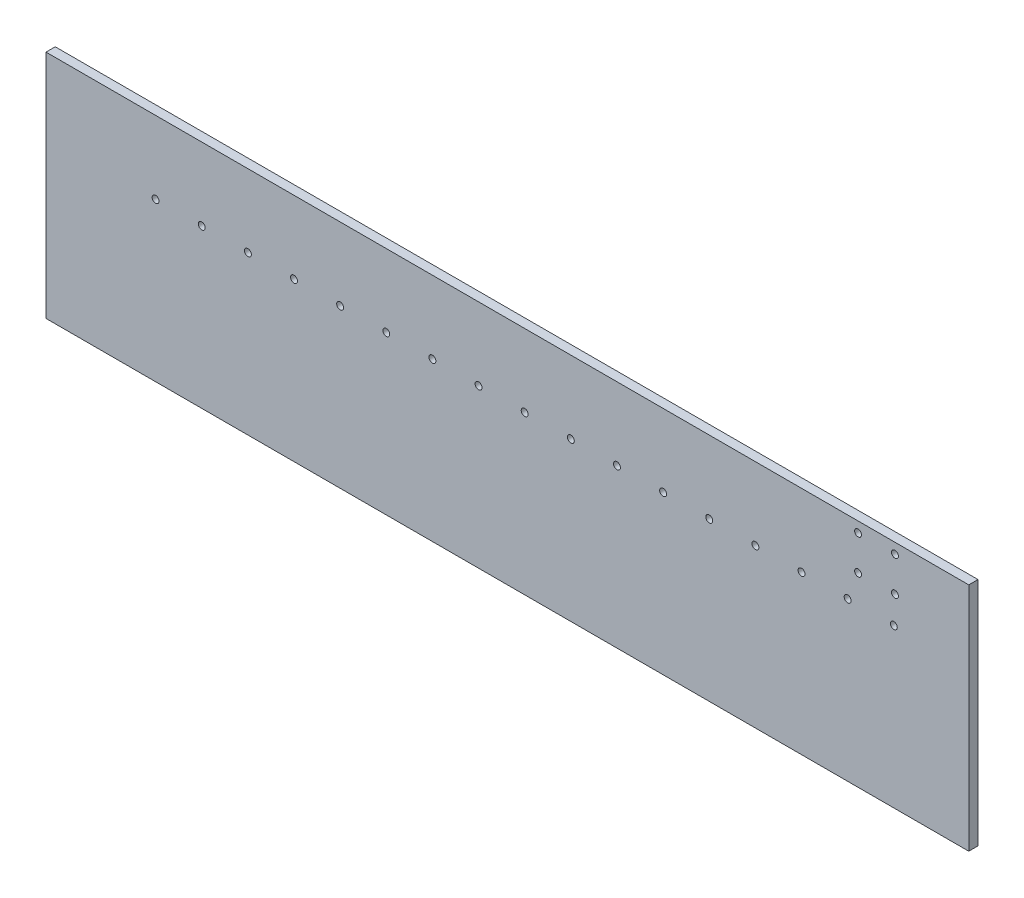
ISO-10303-21;
HEADER;
FILE_DESCRIPTION(('STEP AP214'),'2;1');
FILE_NAME('part.step','',(''),(''),'','','');
FILE_SCHEMA(('AUTOMOTIVE_DESIGN { 1 0 10303 214 1 1 1 1 }'));
ENDSEC;
DATA;
#1=APPLICATION_CONTEXT('core data for automotive mechanical design processes');
#2=APPLICATION_PROTOCOL_DEFINITION('international standard','automotive_design',2000,#1);
#3=PRODUCT_CONTEXT('',#1,'mechanical');
#4=PRODUCT('Part','Part','',(#3));
#5=PRODUCT_RELATED_PRODUCT_CATEGORY('part','',(#4));
#6=PRODUCT_DEFINITION_FORMATION('','',#4);
#7=PRODUCT_DEFINITION_CONTEXT('part definition',#1,'design');
#8=PRODUCT_DEFINITION('design','',#6,#7);
#9=PRODUCT_DEFINITION_SHAPE('','',#8);
#10=(LENGTH_UNIT() NAMED_UNIT(*) SI_UNIT(.MILLI.,.METRE.));
#11=(NAMED_UNIT(*) PLANE_ANGLE_UNIT() SI_UNIT($,.RADIAN.));
#12=(NAMED_UNIT(*) SI_UNIT($,.STERADIAN.) SOLID_ANGLE_UNIT());
#13=UNCERTAINTY_MEASURE_WITH_UNIT(LENGTH_MEASURE(1.E-05),#10,'distance_accuracy_value','');
#14=(GEOMETRIC_REPRESENTATION_CONTEXT(3) GLOBAL_UNCERTAINTY_ASSIGNED_CONTEXT((#13)) GLOBAL_UNIT_ASSIGNED_CONTEXT((#10,
#11,#12)) REPRESENTATION_CONTEXT('',''));
#15=CARTESIAN_POINT('',(0.,0.,0.));
#16=DIRECTION('',(0.,0.,1.));
#17=DIRECTION('',(1.,0.,0.));
#18=AXIS2_PLACEMENT_3D('',#15,#16,#17);
#19=CARTESIAN_POINT('',(47.5000000000003,68.5000000000001,4.));
#20=DIRECTION('',(0.,0.,-1.));
#21=DIRECTION('',(-1.,0.,0.));
#22=AXIS2_PLACEMENT_3D('',#19,#20,#21);
#23=CYLINDRICAL_SURFACE('',#22,1.50000000000002);
#24=CARTESIAN_POINT('',(47.5000000000003,68.5000000000001,4.));
#25=DIRECTION('',(0.,0.,-1.));
#26=DIRECTION('',(-1.,0.,0.));
#27=AXIS2_PLACEMENT_3D('',#24,#25,#26);
#28=CIRCLE('',#27,1.50000000000002);
#29=CARTESIAN_POINT('',(46.0000000000002,68.5000000000001,4.));
#30=VERTEX_POINT('',#29);
#31=EDGE_CURVE('E43',#30,#30,#28,.T.);
#32=ORIENTED_EDGE('',*,*,#31,.F.);
#33=EDGE_LOOP('',(#32));
#34=FACE_BOUND('',#33,.T.);
#35=CARTESIAN_POINT('',(47.5000000000003,68.5000000000001,0.));
#36=DIRECTION('',(0.,0.,-1.));
#37=DIRECTION('',(-1.,0.,0.));
#38=AXIS2_PLACEMENT_3D('',#35,#36,#37);
#39=CIRCLE('',#38,1.50000000000002);
#40=CARTESIAN_POINT('',(46.0000000000002,68.5000000000001,0.));
#41=VERTEX_POINT('',#40);
#42=EDGE_CURVE('E11',#41,#41,#39,.T.);
#43=ORIENTED_EDGE('',*,*,#42,.T.);
#44=EDGE_LOOP('',(#43));
#45=FACE_BOUND('',#44,.T.);
#46=ADVANCED_FACE('F35',(#34,#45),#23,.F.);
#47=CARTESIAN_POINT('',(67.5000000000003,68.5000000000001,4.));
#48=DIRECTION('',(0.,0.,-1.));
#49=DIRECTION('',(-1.,0.,0.));
#50=AXIS2_PLACEMENT_3D('',#47,#48,#49);
#51=CYLINDRICAL_SURFACE('',#50,1.50000000000002);
#52=CARTESIAN_POINT('',(67.5000000000003,68.5000000000001,4.));
#53=DIRECTION('',(0.,0.,-1.));
#54=DIRECTION('',(-1.,0.,0.));
#55=AXIS2_PLACEMENT_3D('',#52,#53,#54);
#56=CIRCLE('',#55,1.50000000000002);
#57=CARTESIAN_POINT('',(66.0000000000003,68.5000000000001,4.));
#58=VERTEX_POINT('',#57);
#59=EDGE_CURVE('E191',#58,#58,#56,.T.);
#60=ORIENTED_EDGE('',*,*,#59,.F.);
#61=EDGE_LOOP('',(#60));
#62=FACE_BOUND('',#61,.T.);
#63=CARTESIAN_POINT('',(67.5000000000003,68.5000000000001,0.));
#64=DIRECTION('',(0.,0.,-1.));
#65=DIRECTION('',(-1.,0.,0.));
#66=AXIS2_PLACEMENT_3D('',#63,#64,#65);
#67=CIRCLE('',#66,1.50000000000002);
#68=CARTESIAN_POINT('',(66.0000000000003,68.5000000000001,0.));
#69=VERTEX_POINT('',#68);
#70=EDGE_CURVE('E194',#69,#69,#67,.T.);
#71=ORIENTED_EDGE('',*,*,#70,.T.);
#72=EDGE_LOOP('',(#71));
#73=FACE_BOUND('',#72,.T.);
#74=ADVANCED_FACE('F202',(#62,#73),#51,.F.);
#75=CARTESIAN_POINT('',(87.5000000000002,68.5000000000001,4.));
#76=DIRECTION('',(0.,0.,-1.));
#77=DIRECTION('',(-1.,0.,0.));
#78=AXIS2_PLACEMENT_3D('',#75,#76,#77);
#79=CYLINDRICAL_SURFACE('',#78,1.50000000000002);
#80=CARTESIAN_POINT('',(87.5000000000002,68.5000000000001,4.));
#81=DIRECTION('',(0.,0.,-1.));
#82=DIRECTION('',(-1.,0.,0.));
#83=AXIS2_PLACEMENT_3D('',#80,#81,#82);
#84=CIRCLE('',#83,1.50000000000002);
#85=CARTESIAN_POINT('',(86.0000000000002,68.5000000000001,4.));
#86=VERTEX_POINT('',#85);
#87=EDGE_CURVE('E185',#86,#86,#84,.T.);
#88=ORIENTED_EDGE('',*,*,#87,.F.);
#89=EDGE_LOOP('',(#88));
#90=FACE_BOUND('',#89,.T.);
#91=CARTESIAN_POINT('',(87.5000000000002,68.5000000000001,0.));
#92=DIRECTION('',(0.,0.,-1.));
#93=DIRECTION('',(-1.,0.,0.));
#94=AXIS2_PLACEMENT_3D('',#91,#92,#93);
#95=CIRCLE('',#94,1.50000000000002);
#96=CARTESIAN_POINT('',(86.0000000000002,68.5000000000001,0.));
#97=VERTEX_POINT('',#96);
#98=EDGE_CURVE('E188',#97,#97,#95,.T.);
#99=ORIENTED_EDGE('',*,*,#98,.T.);
#100=EDGE_LOOP('',(#99));
#101=FACE_BOUND('',#100,.T.);
#102=ADVANCED_FACE('F280',(#90,#101),#79,.F.);
#103=CARTESIAN_POINT('',(107.5,68.5000000000001,4.));
#104=DIRECTION('',(0.,0.,-1.));
#105=DIRECTION('',(-1.,0.,0.));
#106=AXIS2_PLACEMENT_3D('',#103,#104,#105);
#107=CYLINDRICAL_SURFACE('',#106,1.50000000000002);
#108=CARTESIAN_POINT('',(107.5,68.5000000000001,4.));
#109=DIRECTION('',(0.,0.,-1.));
#110=DIRECTION('',(-1.,0.,0.));
#111=AXIS2_PLACEMENT_3D('',#108,#109,#110);
#112=CIRCLE('',#111,1.50000000000002);
#113=CARTESIAN_POINT('',(106.,68.5000000000001,4.));
#114=VERTEX_POINT('',#113);
#115=EDGE_CURVE('E179',#114,#114,#112,.T.);
#116=ORIENTED_EDGE('',*,*,#115,.F.);
#117=EDGE_LOOP('',(#116));
#118=FACE_BOUND('',#117,.T.);
#119=CARTESIAN_POINT('',(107.5,68.5000000000001,0.));
#120=DIRECTION('',(0.,0.,-1.));
#121=DIRECTION('',(-1.,0.,0.));
#122=AXIS2_PLACEMENT_3D('',#119,#120,#121);
#123=CIRCLE('',#122,1.50000000000002);
#124=CARTESIAN_POINT('',(106.,68.5000000000001,0.));
#125=VERTEX_POINT('',#124);
#126=EDGE_CURVE('E182',#125,#125,#123,.T.);
#127=ORIENTED_EDGE('',*,*,#126,.T.);
#128=EDGE_LOOP('',(#127));
#129=FACE_BOUND('',#128,.T.);
#130=ADVANCED_FACE('F276',(#118,#129),#107,.F.);
#131=CARTESIAN_POINT('',(127.5,68.5000000000001,4.));
#132=DIRECTION('',(0.,0.,-1.));
#133=DIRECTION('',(-1.,0.,0.));
#134=AXIS2_PLACEMENT_3D('',#131,#132,#133);
#135=CYLINDRICAL_SURFACE('',#134,1.50000000000002);
#136=CARTESIAN_POINT('',(127.5,68.5000000000001,4.));
#137=DIRECTION('',(0.,0.,-1.));
#138=DIRECTION('',(-1.,0.,0.));
#139=AXIS2_PLACEMENT_3D('',#136,#137,#138);
#140=CIRCLE('',#139,1.50000000000002);
#141=CARTESIAN_POINT('',(126.,68.5000000000001,4.));
#142=VERTEX_POINT('',#141);
#143=EDGE_CURVE('E173',#142,#142,#140,.T.);
#144=ORIENTED_EDGE('',*,*,#143,.F.);
#145=EDGE_LOOP('',(#144));
#146=FACE_BOUND('',#145,.T.);
#147=CARTESIAN_POINT('',(127.5,68.5000000000001,0.));
#148=DIRECTION('',(0.,0.,-1.));
#149=DIRECTION('',(-1.,0.,0.));
#150=AXIS2_PLACEMENT_3D('',#147,#148,#149);
#151=CIRCLE('',#150,1.50000000000002);
#152=CARTESIAN_POINT('',(126.,68.5000000000001,0.));
#153=VERTEX_POINT('',#152);
#154=EDGE_CURVE('E176',#153,#153,#151,.T.);
#155=ORIENTED_EDGE('',*,*,#154,.T.);
#156=EDGE_LOOP('',(#155));
#157=FACE_BOUND('',#156,.T.);
#158=ADVANCED_FACE('F272',(#146,#157),#135,.F.);
#159=CARTESIAN_POINT('',(147.5,68.5000000000001,4.));
#160=DIRECTION('',(0.,0.,-1.));
#161=DIRECTION('',(-1.,0.,0.));
#162=AXIS2_PLACEMENT_3D('',#159,#160,#161);
#163=CYLINDRICAL_SURFACE('',#162,1.50000000000002);
#164=CARTESIAN_POINT('',(147.5,68.5000000000001,4.));
#165=DIRECTION('',(0.,0.,-1.));
#166=DIRECTION('',(-1.,0.,0.));
#167=AXIS2_PLACEMENT_3D('',#164,#165,#166);
#168=CIRCLE('',#167,1.50000000000002);
#169=CARTESIAN_POINT('',(146.,68.5000000000001,4.));
#170=VERTEX_POINT('',#169);
#171=EDGE_CURVE('E167',#170,#170,#168,.T.);
#172=ORIENTED_EDGE('',*,*,#171,.F.);
#173=EDGE_LOOP('',(#172));
#174=FACE_BOUND('',#173,.T.);
#175=CARTESIAN_POINT('',(147.5,68.5000000000001,0.));
#176=DIRECTION('',(0.,0.,-1.));
#177=DIRECTION('',(-1.,0.,0.));
#178=AXIS2_PLACEMENT_3D('',#175,#176,#177);
#179=CIRCLE('',#178,1.50000000000002);
#180=CARTESIAN_POINT('',(146.,68.5000000000001,0.));
#181=VERTEX_POINT('',#180);
#182=EDGE_CURVE('E170',#181,#181,#179,.T.);
#183=ORIENTED_EDGE('',*,*,#182,.T.);
#184=EDGE_LOOP('',(#183));
#185=FACE_BOUND('',#184,.T.);
#186=ADVANCED_FACE('F268',(#174,#185),#163,.F.);
#187=CARTESIAN_POINT('',(167.5,68.5000000000001,4.));
#188=DIRECTION('',(0.,0.,-1.));
#189=DIRECTION('',(-1.,0.,0.));
#190=AXIS2_PLACEMENT_3D('',#187,#188,#189);
#191=CYLINDRICAL_SURFACE('',#190,1.50000000000002);
#192=CARTESIAN_POINT('',(167.5,68.5000000000001,4.));
#193=DIRECTION('',(0.,0.,-1.));
#194=DIRECTION('',(-1.,0.,0.));
#195=AXIS2_PLACEMENT_3D('',#192,#193,#194);
#196=CIRCLE('',#195,1.50000000000002);
#197=CARTESIAN_POINT('',(166.,68.5000000000001,4.));
#198=VERTEX_POINT('',#197);
#199=EDGE_CURVE('E161',#198,#198,#196,.T.);
#200=ORIENTED_EDGE('',*,*,#199,.F.);
#201=EDGE_LOOP('',(#200));
#202=FACE_BOUND('',#201,.T.);
#203=CARTESIAN_POINT('',(167.5,68.5000000000001,0.));
#204=DIRECTION('',(0.,0.,-1.));
#205=DIRECTION('',(-1.,0.,0.));
#206=AXIS2_PLACEMENT_3D('',#203,#204,#205);
#207=CIRCLE('',#206,1.50000000000002);
#208=CARTESIAN_POINT('',(166.,68.5000000000001,0.));
#209=VERTEX_POINT('',#208);
#210=EDGE_CURVE('E164',#209,#209,#207,.T.);
#211=ORIENTED_EDGE('',*,*,#210,.T.);
#212=EDGE_LOOP('',(#211));
#213=FACE_BOUND('',#212,.T.);
#214=ADVANCED_FACE('F264',(#202,#213),#191,.F.);
#215=CARTESIAN_POINT('',(187.5,68.5000000000001,4.));
#216=DIRECTION('',(0.,0.,-1.));
#217=DIRECTION('',(-1.,0.,0.));
#218=AXIS2_PLACEMENT_3D('',#215,#216,#217);
#219=CYLINDRICAL_SURFACE('',#218,1.50000000000002);
#220=CARTESIAN_POINT('',(187.5,68.5000000000001,4.));
#221=DIRECTION('',(0.,0.,-1.));
#222=DIRECTION('',(-1.,0.,0.));
#223=AXIS2_PLACEMENT_3D('',#220,#221,#222);
#224=CIRCLE('',#223,1.50000000000002);
#225=CARTESIAN_POINT('',(186.,68.5000000000001,4.));
#226=VERTEX_POINT('',#225);
#227=EDGE_CURVE('E155',#226,#226,#224,.T.);
#228=ORIENTED_EDGE('',*,*,#227,.F.);
#229=EDGE_LOOP('',(#228));
#230=FACE_BOUND('',#229,.T.);
#231=CARTESIAN_POINT('',(187.5,68.5000000000001,0.));
#232=DIRECTION('',(0.,0.,-1.));
#233=DIRECTION('',(-1.,0.,0.));
#234=AXIS2_PLACEMENT_3D('',#231,#232,#233);
#235=CIRCLE('',#234,1.50000000000002);
#236=CARTESIAN_POINT('',(186.,68.5000000000001,0.));
#237=VERTEX_POINT('',#236);
#238=EDGE_CURVE('E158',#237,#237,#235,.T.);
#239=ORIENTED_EDGE('',*,*,#238,.T.);
#240=EDGE_LOOP('',(#239));
#241=FACE_BOUND('',#240,.T.);
#242=ADVANCED_FACE('F260',(#230,#241),#219,.F.);
#243=CARTESIAN_POINT('',(207.5,68.5000000000001,4.));
#244=DIRECTION('',(0.,0.,-1.));
#245=DIRECTION('',(-1.,0.,0.));
#246=AXIS2_PLACEMENT_3D('',#243,#244,#245);
#247=CYLINDRICAL_SURFACE('',#246,1.50000000000002);
#248=CARTESIAN_POINT('',(207.5,68.5000000000001,4.));
#249=DIRECTION('',(0.,0.,-1.));
#250=DIRECTION('',(-1.,0.,0.));
#251=AXIS2_PLACEMENT_3D('',#248,#249,#250);
#252=CIRCLE('',#251,1.50000000000002);
#253=CARTESIAN_POINT('',(206.,68.5000000000001,4.));
#254=VERTEX_POINT('',#253);
#255=EDGE_CURVE('E149',#254,#254,#252,.T.);
#256=ORIENTED_EDGE('',*,*,#255,.F.);
#257=EDGE_LOOP('',(#256));
#258=FACE_BOUND('',#257,.T.);
#259=CARTESIAN_POINT('',(207.5,68.5000000000001,0.));
#260=DIRECTION('',(0.,0.,-1.));
#261=DIRECTION('',(-1.,0.,0.));
#262=AXIS2_PLACEMENT_3D('',#259,#260,#261);
#263=CIRCLE('',#262,1.50000000000002);
#264=CARTESIAN_POINT('',(206.,68.5000000000001,0.));
#265=VERTEX_POINT('',#264);
#266=EDGE_CURVE('E152',#265,#265,#263,.T.);
#267=ORIENTED_EDGE('',*,*,#266,.T.);
#268=EDGE_LOOP('',(#267));
#269=FACE_BOUND('',#268,.T.);
#270=ADVANCED_FACE('F256',(#258,#269),#247,.F.);
#271=CARTESIAN_POINT('',(227.5,68.5000000000001,4.));
#272=DIRECTION('',(0.,0.,-1.));
#273=DIRECTION('',(-1.,0.,0.));
#274=AXIS2_PLACEMENT_3D('',#271,#272,#273);
#275=CYLINDRICAL_SURFACE('',#274,1.50000000000002);
#276=CARTESIAN_POINT('',(227.5,68.5000000000001,4.));
#277=DIRECTION('',(0.,0.,-1.));
#278=DIRECTION('',(-1.,0.,0.));
#279=AXIS2_PLACEMENT_3D('',#276,#277,#278);
#280=CIRCLE('',#279,1.50000000000002);
#281=CARTESIAN_POINT('',(226.,68.5000000000001,4.));
#282=VERTEX_POINT('',#281);
#283=EDGE_CURVE('E143',#282,#282,#280,.T.);
#284=ORIENTED_EDGE('',*,*,#283,.F.);
#285=EDGE_LOOP('',(#284));
#286=FACE_BOUND('',#285,.T.);
#287=CARTESIAN_POINT('',(227.5,68.5000000000001,0.));
#288=DIRECTION('',(0.,0.,-1.));
#289=DIRECTION('',(-1.,0.,0.));
#290=AXIS2_PLACEMENT_3D('',#287,#288,#289);
#291=CIRCLE('',#290,1.50000000000002);
#292=CARTESIAN_POINT('',(226.,68.5000000000001,0.));
#293=VERTEX_POINT('',#292);
#294=EDGE_CURVE('E146',#293,#293,#291,.T.);
#295=ORIENTED_EDGE('',*,*,#294,.T.);
#296=EDGE_LOOP('',(#295));
#297=FACE_BOUND('',#296,.T.);
#298=ADVANCED_FACE('F252',(#286,#297),#275,.F.);
#299=CARTESIAN_POINT('',(247.5,68.5000000000001,4.));
#300=DIRECTION('',(0.,0.,-1.));
#301=DIRECTION('',(-1.,0.,0.));
#302=AXIS2_PLACEMENT_3D('',#299,#300,#301);
#303=CYLINDRICAL_SURFACE('',#302,1.50000000000002);
#304=CARTESIAN_POINT('',(247.5,68.5000000000001,4.));
#305=DIRECTION('',(0.,0.,-1.));
#306=DIRECTION('',(-1.,0.,0.));
#307=AXIS2_PLACEMENT_3D('',#304,#305,#306);
#308=CIRCLE('',#307,1.50000000000002);
#309=CARTESIAN_POINT('',(246.,68.5000000000001,4.));
#310=VERTEX_POINT('',#309);
#311=EDGE_CURVE('E137',#310,#310,#308,.T.);
#312=ORIENTED_EDGE('',*,*,#311,.F.);
#313=EDGE_LOOP('',(#312));
#314=FACE_BOUND('',#313,.T.);
#315=CARTESIAN_POINT('',(247.5,68.5000000000001,0.));
#316=DIRECTION('',(0.,0.,-1.));
#317=DIRECTION('',(-1.,0.,0.));
#318=AXIS2_PLACEMENT_3D('',#315,#316,#317);
#319=CIRCLE('',#318,1.50000000000002);
#320=CARTESIAN_POINT('',(246.,68.5000000000001,0.));
#321=VERTEX_POINT('',#320);
#322=EDGE_CURVE('E140',#321,#321,#319,.T.);
#323=ORIENTED_EDGE('',*,*,#322,.T.);
#324=EDGE_LOOP('',(#323));
#325=FACE_BOUND('',#324,.T.);
#326=ADVANCED_FACE('F248',(#314,#325),#303,.F.);
#327=CARTESIAN_POINT('',(267.5,68.5000000000001,4.));
#328=DIRECTION('',(0.,0.,-1.));
#329=DIRECTION('',(-1.,0.,0.));
#330=AXIS2_PLACEMENT_3D('',#327,#328,#329);
#331=CYLINDRICAL_SURFACE('',#330,1.50000000000002);
#332=CARTESIAN_POINT('',(267.5,68.5000000000001,4.));
#333=DIRECTION('',(0.,0.,-1.));
#334=DIRECTION('',(-1.,0.,0.));
#335=AXIS2_PLACEMENT_3D('',#332,#333,#334);
#336=CIRCLE('',#335,1.50000000000002);
#337=CARTESIAN_POINT('',(266.,68.5000000000001,4.));
#338=VERTEX_POINT('',#337);
#339=EDGE_CURVE('E131',#338,#338,#336,.T.);
#340=ORIENTED_EDGE('',*,*,#339,.F.);
#341=EDGE_LOOP('',(#340));
#342=FACE_BOUND('',#341,.T.);
#343=CARTESIAN_POINT('',(267.5,68.5000000000001,0.));
#344=DIRECTION('',(0.,0.,-1.));
#345=DIRECTION('',(-1.,0.,0.));
#346=AXIS2_PLACEMENT_3D('',#343,#344,#345);
#347=CIRCLE('',#346,1.50000000000002);
#348=CARTESIAN_POINT('',(266.,68.5000000000001,0.));
#349=VERTEX_POINT('',#348);
#350=EDGE_CURVE('E134',#349,#349,#347,.T.);
#351=ORIENTED_EDGE('',*,*,#350,.T.);
#352=EDGE_LOOP('',(#351));
#353=FACE_BOUND('',#352,.T.);
#354=ADVANCED_FACE('F244',(#342,#353),#331,.F.);
#355=CARTESIAN_POINT('',(287.5,68.5000000000001,4.));
#356=DIRECTION('',(0.,0.,-1.));
#357=DIRECTION('',(-1.,0.,0.));
#358=AXIS2_PLACEMENT_3D('',#355,#356,#357);
#359=CYLINDRICAL_SURFACE('',#358,1.50000000000002);
#360=CARTESIAN_POINT('',(287.5,68.5000000000001,4.));
#361=DIRECTION('',(0.,0.,-1.));
#362=DIRECTION('',(-1.,0.,0.));
#363=AXIS2_PLACEMENT_3D('',#360,#361,#362);
#364=CIRCLE('',#363,1.50000000000002);
#365=CARTESIAN_POINT('',(286.,68.5000000000001,4.));
#366=VERTEX_POINT('',#365);
#367=EDGE_CURVE('E125',#366,#366,#364,.T.);
#368=ORIENTED_EDGE('',*,*,#367,.F.);
#369=EDGE_LOOP('',(#368));
#370=FACE_BOUND('',#369,.T.);
#371=CARTESIAN_POINT('',(287.5,68.5000000000001,0.));
#372=DIRECTION('',(0.,0.,-1.));
#373=DIRECTION('',(-1.,0.,0.));
#374=AXIS2_PLACEMENT_3D('',#371,#372,#373);
#375=CIRCLE('',#374,1.50000000000002);
#376=CARTESIAN_POINT('',(286.,68.5000000000001,0.));
#377=VERTEX_POINT('',#376);
#378=EDGE_CURVE('E128',#377,#377,#375,.T.);
#379=ORIENTED_EDGE('',*,*,#378,.T.);
#380=EDGE_LOOP('',(#379));
#381=FACE_BOUND('',#380,.T.);
#382=ADVANCED_FACE('F240',(#370,#381),#359,.F.);
#383=CARTESIAN_POINT('',(307.5,68.5000000000001,4.));
#384=DIRECTION('',(0.,0.,-1.));
#385=DIRECTION('',(-1.,0.,0.));
#386=AXIS2_PLACEMENT_3D('',#383,#384,#385);
#387=CYLINDRICAL_SURFACE('',#386,1.50000000000002);
#388=CARTESIAN_POINT('',(307.5,68.5000000000001,4.));
#389=DIRECTION('',(0.,0.,-1.));
#390=DIRECTION('',(-1.,0.,0.));
#391=AXIS2_PLACEMENT_3D('',#388,#389,#390);
#392=CIRCLE('',#391,1.50000000000002);
#393=CARTESIAN_POINT('',(306.,68.5000000000001,4.));
#394=VERTEX_POINT('',#393);
#395=EDGE_CURVE('E119',#394,#394,#392,.T.);
#396=ORIENTED_EDGE('',*,*,#395,.F.);
#397=EDGE_LOOP('',(#396));
#398=FACE_BOUND('',#397,.T.);
#399=CARTESIAN_POINT('',(307.5,68.5000000000001,0.));
#400=DIRECTION('',(0.,0.,-1.));
#401=DIRECTION('',(-1.,0.,0.));
#402=AXIS2_PLACEMENT_3D('',#399,#400,#401);
#403=CIRCLE('',#402,1.50000000000002);
#404=CARTESIAN_POINT('',(306.,68.5000000000001,0.));
#405=VERTEX_POINT('',#404);
#406=EDGE_CURVE('E122',#405,#405,#403,.T.);
#407=ORIENTED_EDGE('',*,*,#406,.T.);
#408=EDGE_LOOP('',(#407));
#409=FACE_BOUND('',#408,.T.);
#410=ADVANCED_FACE('F236',(#398,#409),#387,.F.);
#411=CARTESIAN_POINT('',(327.5,68.5000000000001,4.));
#412=DIRECTION('',(0.,0.,-1.));
#413=DIRECTION('',(-1.,0.,0.));
#414=AXIS2_PLACEMENT_3D('',#411,#412,#413);
#415=CYLINDRICAL_SURFACE('',#414,1.50000000000002);
#416=CARTESIAN_POINT('',(327.5,68.5000000000001,4.));
#417=DIRECTION('',(0.,0.,-1.));
#418=DIRECTION('',(-1.,0.,0.));
#419=AXIS2_PLACEMENT_3D('',#416,#417,#418);
#420=CIRCLE('',#419,1.50000000000002);
#421=CARTESIAN_POINT('',(326.,68.5000000000001,4.));
#422=VERTEX_POINT('',#421);
#423=EDGE_CURVE('E113',#422,#422,#420,.T.);
#424=ORIENTED_EDGE('',*,*,#423,.F.);
#425=EDGE_LOOP('',(#424));
#426=FACE_BOUND('',#425,.T.);
#427=CARTESIAN_POINT('',(327.5,68.5000000000001,0.));
#428=DIRECTION('',(0.,0.,-1.));
#429=DIRECTION('',(-1.,0.,0.));
#430=AXIS2_PLACEMENT_3D('',#427,#428,#429);
#431=CIRCLE('',#430,1.50000000000002);
#432=CARTESIAN_POINT('',(326.,68.5000000000001,0.));
#433=VERTEX_POINT('',#432);
#434=EDGE_CURVE('E116',#433,#433,#431,.T.);
#435=ORIENTED_EDGE('',*,*,#434,.T.);
#436=EDGE_LOOP('',(#435));
#437=FACE_BOUND('',#436,.T.);
#438=ADVANCED_FACE('F232',(#426,#437),#415,.F.);
#439=CARTESIAN_POINT('',(0.,0.,4.));
#440=DIRECTION('',(1.,0.,0.));
#441=DIRECTION('',(0.,0.,-1.));
#442=AXIS2_PLACEMENT_3D('',#439,#440,#441);
#443=PLANE('',#442);
#444=DIRECTION('',(0.,-1.,0.));
#445=VECTOR('',#444,1.);
#446=CARTESIAN_POINT('',(0.,0.,0.));
#447=LINE('',#446,#445);
#448=CARTESIAN_POINT('',(0.,100.,0.));
#449=VERTEX_POINT('',#448);
#450=CARTESIAN_POINT('',(0.,0.,0.));
#451=VERTEX_POINT('',#450);
#452=EDGE_CURVE('E103',#449,#451,#447,.T.);
#453=ORIENTED_EDGE('',*,*,#452,.T.);
#454=DIRECTION('',(0.,0.,-1.));
#455=VECTOR('',#454,1.);
#456=CARTESIAN_POINT('',(0.,0.,4.));
#457=LINE('',#456,#455);
#458=CARTESIAN_POINT('',(0.,0.,4.));
#459=VERTEX_POINT('',#458);
#460=EDGE_CURVE('E94',#459,#451,#457,.T.);
#461=ORIENTED_EDGE('',*,*,#460,.F.);
#462=DIRECTION('',(0.,-1.,0.));
#463=VECTOR('',#462,1.);
#464=CARTESIAN_POINT('',(0.,0.,4.));
#465=LINE('',#464,#463);
#466=CARTESIAN_POINT('',(0.,100.,4.));
#467=VERTEX_POINT('',#466);
#468=EDGE_CURVE('E88',#467,#459,#465,.T.);
#469=ORIENTED_EDGE('',*,*,#468,.F.);
#470=DIRECTION('',(0.,0.,-1.));
#471=VECTOR('',#470,1.);
#472=CARTESIAN_POINT('',(0.,100.,4.));
#473=LINE('',#472,#471);
#474=EDGE_CURVE('E99',#467,#449,#473,.T.);
#475=ORIENTED_EDGE('',*,*,#474,.T.);
#476=EDGE_LOOP('',(#453,#461,#469,#475));
#477=FACE_BOUND('',#476,.T.);
#478=ADVANCED_FACE('F229',(#477),#443,.F.);
#479=CARTESIAN_POINT('',(0.,0.,4.));
#480=DIRECTION('',(0.,1.,0.));
#481=DIRECTION('',(0.,0.,1.));
#482=AXIS2_PLACEMENT_3D('',#479,#480,#481);
#483=PLANE('',#482);
#484=DIRECTION('',(1.,0.,0.));
#485=VECTOR('',#484,1.);
#486=CARTESIAN_POINT('',(0.,0.,0.));
#487=LINE('',#486,#485);
#488=CARTESIAN_POINT('',(400.,0.,0.));
#489=VERTEX_POINT('',#488);
#490=EDGE_CURVE('E93',#451,#489,#487,.T.);
#491=ORIENTED_EDGE('',*,*,#490,.T.);
#492=DIRECTION('',(0.,0.,-1.));
#493=VECTOR('',#492,1.);
#494=CARTESIAN_POINT('',(400.,0.,4.));
#495=LINE('',#494,#493);
#496=CARTESIAN_POINT('',(400.,0.,4.));
#497=VERTEX_POINT('',#496);
#498=EDGE_CURVE('E91',#497,#489,#495,.T.);
#499=ORIENTED_EDGE('',*,*,#498,.F.);
#500=DIRECTION('',(1.,0.,0.));
#501=VECTOR('',#500,1.);
#502=CARTESIAN_POINT('',(0.,0.,4.));
#503=LINE('',#502,#501);
#504=EDGE_CURVE('E82',#459,#497,#503,.T.);
#505=ORIENTED_EDGE('',*,*,#504,.F.);
#506=ORIENTED_EDGE('',*,*,#460,.T.);
#507=EDGE_LOOP('',(#491,#499,#505,#506));
#508=FACE_BOUND('',#507,.T.);
#509=ADVANCED_FACE('F92',(#508),#483,.F.);
#510=CARTESIAN_POINT('',(400.,0.,4.));
#511=DIRECTION('',(-1.,0.,0.));
#512=DIRECTION('',(0.,0.,1.));
#513=AXIS2_PLACEMENT_3D('',#510,#511,#512);
#514=PLANE('',#513);
#515=DIRECTION('',(0.,1.,0.));
#516=VECTOR('',#515,1.);
#517=CARTESIAN_POINT('',(400.,0.,0.));
#518=LINE('',#517,#516);
#519=CARTESIAN_POINT('',(400.,100.,0.));
#520=VERTEX_POINT('',#519);
#521=EDGE_CURVE('E68',#489,#520,#518,.T.);
#522=ORIENTED_EDGE('',*,*,#521,.T.);
#523=DIRECTION('',(0.,0.,-1.));
#524=VECTOR('',#523,1.);
#525=CARTESIAN_POINT('',(400.,100.,4.));
#526=LINE('',#525,#524);
#527=CARTESIAN_POINT('',(400.,100.,4.));
#528=VERTEX_POINT('',#527);
#529=EDGE_CURVE('E95',#528,#520,#526,.T.);
#530=ORIENTED_EDGE('',*,*,#529,.F.);
#531=DIRECTION('',(0.,1.,0.));
#532=VECTOR('',#531,1.);
#533=CARTESIAN_POINT('',(400.,0.,4.));
#534=LINE('',#533,#532);
#535=EDGE_CURVE('E86',#497,#528,#534,.T.);
#536=ORIENTED_EDGE('',*,*,#535,.F.);
#537=ORIENTED_EDGE('',*,*,#498,.T.);
#538=EDGE_LOOP('',(#522,#530,#536,#537));
#539=FACE_BOUND('',#538,.T.);
#540=ADVANCED_FACE('F97',(#539),#514,.F.);
#541=CARTESIAN_POINT('',(0.,100.,4.));
#542=DIRECTION('',(0.,-1.,0.));
#543=DIRECTION('',(0.,0.,-1.));
#544=AXIS2_PLACEMENT_3D('',#541,#542,#543);
#545=PLANE('',#544);
#546=DIRECTION('',(-1.,0.,0.));
#547=VECTOR('',#546,1.);
#548=CARTESIAN_POINT('',(0.,100.,0.));
#549=LINE('',#548,#547);
#550=EDGE_CURVE('E74',#520,#449,#549,.T.);
#551=ORIENTED_EDGE('',*,*,#550,.T.);
#552=ORIENTED_EDGE('',*,*,#474,.F.);
#553=DIRECTION('',(-1.,0.,0.));
#554=VECTOR('',#553,1.);
#555=CARTESIAN_POINT('',(0.,100.,4.));
#556=LINE('',#555,#554);
#557=EDGE_CURVE('E51',#528,#467,#556,.T.);
#558=ORIENTED_EDGE('',*,*,#557,.F.);
#559=ORIENTED_EDGE('',*,*,#529,.T.);
#560=EDGE_LOOP('',(#551,#552,#558,#559));
#561=FACE_BOUND('',#560,.T.);
#562=ADVANCED_FACE('F217',(#561),#545,.F.);
#563=CARTESIAN_POINT('',(0.,0.,4.));
#564=DIRECTION('',(0.,0.,-1.));
#565=DIRECTION('',(-1.,0.,0.));
#566=AXIS2_PLACEMENT_3D('',#563,#564,#565);
#567=PLANE('',#566);
#568=CARTESIAN_POINT('',(347.5,68.5000000000001,4.));
#569=DIRECTION('',(0.,0.,-1.));
#570=DIRECTION('',(-1.,0.,0.));
#571=AXIS2_PLACEMENT_3D('',#568,#569,#570);
#572=CIRCLE('',#571,1.50000000000002);
#573=CARTESIAN_POINT('',(346.,68.5000000000001,4.));
#574=VERTEX_POINT('',#573);
#575=EDGE_CURVE('E556',#574,#574,#572,.T.);
#576=ORIENTED_EDGE('',*,*,#575,.T.);
#577=EDGE_LOOP('',(#576));
#578=FACE_BOUND('',#577,.T.);
#579=CARTESIAN_POINT('',(367.5,68.5000000000001,4.));
#580=DIRECTION('',(0.,0.,-1.));
#581=DIRECTION('',(-1.,0.,0.));
#582=AXIS2_PLACEMENT_3D('',#579,#580,#581);
#583=CIRCLE('',#582,1.50000000000002);
#584=CARTESIAN_POINT('',(366.,68.5000000000001,4.));
#585=VERTEX_POINT('',#584);
#586=EDGE_CURVE('E470',#585,#585,#583,.T.);
#587=ORIENTED_EDGE('',*,*,#586,.T.);
#588=EDGE_LOOP('',(#587));
#589=FACE_BOUND('',#588,.T.);
#590=CARTESIAN_POINT('',(352.,95.5,4.));
#591=DIRECTION('',(0.,0.,-1.));
#592=DIRECTION('',(-1.,0.,0.));
#593=AXIS2_PLACEMENT_3D('',#590,#591,#592);
#594=CIRCLE('',#593,1.50000000000002);
#595=CARTESIAN_POINT('',(350.5,95.5,4.));
#596=VERTEX_POINT('',#595);
#597=EDGE_CURVE('E479',#596,#596,#594,.T.);
#598=ORIENTED_EDGE('',*,*,#597,.T.);
#599=EDGE_LOOP('',(#598));
#600=FACE_BOUND('',#599,.T.);
#601=CARTESIAN_POINT('',(368.,80.5,4.));
#602=DIRECTION('',(0.,0.,-1.));
#603=DIRECTION('',(-1.,0.,0.));
#604=AXIS2_PLACEMENT_3D('',#601,#602,#603);
#605=CIRCLE('',#604,1.50000000000002);
#606=CARTESIAN_POINT('',(366.5,80.5,4.));
#607=VERTEX_POINT('',#606);
#608=EDGE_CURVE('E486',#607,#607,#605,.T.);
#609=ORIENTED_EDGE('',*,*,#608,.T.);
#610=EDGE_LOOP('',(#609));
#611=FACE_BOUND('',#610,.T.);
#612=CARTESIAN_POINT('',(352.,80.5,4.));
#613=DIRECTION('',(0.,0.,-1.));
#614=DIRECTION('',(-1.,0.,0.));
#615=AXIS2_PLACEMENT_3D('',#612,#613,#614);
#616=CIRCLE('',#615,1.50000000000002);
#617=CARTESIAN_POINT('',(350.5,80.5,4.));
#618=VERTEX_POINT('',#617);
#619=EDGE_CURVE('E465',#618,#618,#616,.T.);
#620=ORIENTED_EDGE('',*,*,#619,.T.);
#621=EDGE_LOOP('',(#620));
#622=FACE_BOUND('',#621,.T.);
#623=CARTESIAN_POINT('',(368.,95.5,4.));
#624=DIRECTION('',(0.,0.,-1.));
#625=DIRECTION('',(-1.,0.,0.));
#626=AXIS2_PLACEMENT_3D('',#623,#624,#625);
#627=CIRCLE('',#626,1.50000000000002);
#628=CARTESIAN_POINT('',(366.5,95.5,4.));
#629=VERTEX_POINT('',#628);
#630=EDGE_CURVE('E106',#629,#629,#627,.T.);
#631=ORIENTED_EDGE('',*,*,#630,.T.);
#632=EDGE_LOOP('',(#631));
#633=FACE_BOUND('',#632,.T.);
#634=ORIENTED_EDGE('',*,*,#468,.T.);
#635=ORIENTED_EDGE('',*,*,#504,.T.);
#636=ORIENTED_EDGE('',*,*,#535,.T.);
#637=ORIENTED_EDGE('',*,*,#557,.T.);
#638=EDGE_LOOP('',(#634,#635,#636,#637));
#639=FACE_BOUND('',#638,.T.);
#640=ORIENTED_EDGE('',*,*,#423,.T.);
#641=EDGE_LOOP('',(#640));
#642=FACE_BOUND('',#641,.T.);
#643=ORIENTED_EDGE('',*,*,#395,.T.);
#644=EDGE_LOOP('',(#643));
#645=FACE_BOUND('',#644,.T.);
#646=ORIENTED_EDGE('',*,*,#367,.T.);
#647=EDGE_LOOP('',(#646));
#648=FACE_BOUND('',#647,.T.);
#649=ORIENTED_EDGE('',*,*,#339,.T.);
#650=EDGE_LOOP('',(#649));
#651=FACE_BOUND('',#650,.T.);
#652=ORIENTED_EDGE('',*,*,#311,.T.);
#653=EDGE_LOOP('',(#652));
#654=FACE_BOUND('',#653,.T.);
#655=ORIENTED_EDGE('',*,*,#283,.T.);
#656=EDGE_LOOP('',(#655));
#657=FACE_BOUND('',#656,.T.);
#658=ORIENTED_EDGE('',*,*,#255,.T.);
#659=EDGE_LOOP('',(#658));
#660=FACE_BOUND('',#659,.T.);
#661=ORIENTED_EDGE('',*,*,#227,.T.);
#662=EDGE_LOOP('',(#661));
#663=FACE_BOUND('',#662,.T.);
#664=ORIENTED_EDGE('',*,*,#199,.T.);
#665=EDGE_LOOP('',(#664));
#666=FACE_BOUND('',#665,.T.);
#667=ORIENTED_EDGE('',*,*,#171,.T.);
#668=EDGE_LOOP('',(#667));
#669=FACE_BOUND('',#668,.T.);
#670=ORIENTED_EDGE('',*,*,#143,.T.);
#671=EDGE_LOOP('',(#670));
#672=FACE_BOUND('',#671,.T.);
#673=ORIENTED_EDGE('',*,*,#115,.T.);
#674=EDGE_LOOP('',(#673));
#675=FACE_BOUND('',#674,.T.);
#676=ORIENTED_EDGE('',*,*,#87,.T.);
#677=EDGE_LOOP('',(#676));
#678=FACE_BOUND('',#677,.T.);
#679=ORIENTED_EDGE('',*,*,#59,.T.);
#680=EDGE_LOOP('',(#679));
#681=FACE_BOUND('',#680,.T.);
#682=ORIENTED_EDGE('',*,*,#31,.T.);
#683=EDGE_LOOP('',(#682));
#684=FACE_BOUND('',#683,.T.);
#685=ADVANCED_FACE('F83',(#578,#589,#600,#611,#622,#633,#639,#642,#645,#648,#651,#654,#657,#660,
#663,#666,#669,#672,#675,#678,#681,#684),#567,.F.);
#686=CARTESIAN_POINT('',(0.,0.,0.));
#687=DIRECTION('',(0.,0.,-1.));
#688=DIRECTION('',(-1.,0.,0.));
#689=AXIS2_PLACEMENT_3D('',#686,#687,#688);
#690=PLANE('',#689);
#691=CARTESIAN_POINT('',(347.5,68.5000000000001,0.));
#692=DIRECTION('',(0.,0.,-1.));
#693=DIRECTION('',(-1.,0.,0.));
#694=AXIS2_PLACEMENT_3D('',#691,#692,#693);
#695=CIRCLE('',#694,1.50000000000002);
#696=CARTESIAN_POINT('',(346.,68.5000000000001,0.));
#697=VERTEX_POINT('',#696);
#698=EDGE_CURVE('E552',#697,#697,#695,.T.);
#699=ORIENTED_EDGE('',*,*,#698,.F.);
#700=EDGE_LOOP('',(#699));
#701=FACE_BOUND('',#700,.T.);
#702=CARTESIAN_POINT('',(367.5,68.5000000000001,0.));
#703=DIRECTION('',(0.,0.,-1.));
#704=DIRECTION('',(-1.,0.,0.));
#705=AXIS2_PLACEMENT_3D('',#702,#703,#704);
#706=CIRCLE('',#705,1.50000000000002);
#707=CARTESIAN_POINT('',(366.,68.5000000000001,0.));
#708=VERTEX_POINT('',#707);
#709=EDGE_CURVE('E475',#708,#708,#706,.T.);
#710=ORIENTED_EDGE('',*,*,#709,.F.);
#711=EDGE_LOOP('',(#710));
#712=FACE_BOUND('',#711,.T.);
#713=CARTESIAN_POINT('',(352.,95.5,0.));
#714=DIRECTION('',(0.,0.,-1.));
#715=DIRECTION('',(-1.,0.,0.));
#716=AXIS2_PLACEMENT_3D('',#713,#714,#715);
#717=CIRCLE('',#716,1.50000000000002);
#718=CARTESIAN_POINT('',(350.5,95.5,0.));
#719=VERTEX_POINT('',#718);
#720=EDGE_CURVE('E483',#719,#719,#717,.T.);
#721=ORIENTED_EDGE('',*,*,#720,.F.);
#722=EDGE_LOOP('',(#721));
#723=FACE_BOUND('',#722,.T.);
#724=CARTESIAN_POINT('',(368.,80.5,0.));
#725=DIRECTION('',(0.,0.,-1.));
#726=DIRECTION('',(-1.,0.,0.));
#727=AXIS2_PLACEMENT_3D('',#724,#725,#726);
#728=CIRCLE('',#727,1.50000000000002);
#729=CARTESIAN_POINT('',(366.5,80.5,0.));
#730=VERTEX_POINT('',#729);
#731=EDGE_CURVE('E472',#730,#730,#728,.T.);
#732=ORIENTED_EDGE('',*,*,#731,.F.);
#733=EDGE_LOOP('',(#732));
#734=FACE_BOUND('',#733,.T.);
#735=CARTESIAN_POINT('',(352.,80.5,0.));
#736=DIRECTION('',(0.,0.,-1.));
#737=DIRECTION('',(-1.,0.,0.));
#738=AXIS2_PLACEMENT_3D('',#735,#736,#737);
#739=CIRCLE('',#738,1.50000000000002);
#740=CARTESIAN_POINT('',(350.5,80.5,0.));
#741=VERTEX_POINT('',#740);
#742=EDGE_CURVE('E468',#741,#741,#739,.T.);
#743=ORIENTED_EDGE('',*,*,#742,.F.);
#744=EDGE_LOOP('',(#743));
#745=FACE_BOUND('',#744,.T.);
#746=CARTESIAN_POINT('',(368.,95.5,0.));
#747=DIRECTION('',(0.,0.,-1.));
#748=DIRECTION('',(-1.,0.,0.));
#749=AXIS2_PLACEMENT_3D('',#746,#747,#748);
#750=CIRCLE('',#749,1.50000000000002);
#751=CARTESIAN_POINT('',(366.5,95.5,0.));
#752=VERTEX_POINT('',#751);
#753=EDGE_CURVE('E482',#752,#752,#750,.T.);
#754=ORIENTED_EDGE('',*,*,#753,.F.);
#755=EDGE_LOOP('',(#754));
#756=FACE_BOUND('',#755,.T.);
#757=ORIENTED_EDGE('',*,*,#452,.F.);
#758=ORIENTED_EDGE('',*,*,#550,.F.);
#759=ORIENTED_EDGE('',*,*,#521,.F.);
#760=ORIENTED_EDGE('',*,*,#490,.F.);
#761=EDGE_LOOP('',(#757,#758,#759,#760));
#762=FACE_BOUND('',#761,.T.);
#763=ORIENTED_EDGE('',*,*,#434,.F.);
#764=EDGE_LOOP('',(#763));
#765=FACE_BOUND('',#764,.T.);
#766=ORIENTED_EDGE('',*,*,#406,.F.);
#767=EDGE_LOOP('',(#766));
#768=FACE_BOUND('',#767,.T.);
#769=ORIENTED_EDGE('',*,*,#378,.F.);
#770=EDGE_LOOP('',(#769));
#771=FACE_BOUND('',#770,.T.);
#772=ORIENTED_EDGE('',*,*,#350,.F.);
#773=EDGE_LOOP('',(#772));
#774=FACE_BOUND('',#773,.T.);
#775=ORIENTED_EDGE('',*,*,#322,.F.);
#776=EDGE_LOOP('',(#775));
#777=FACE_BOUND('',#776,.T.);
#778=ORIENTED_EDGE('',*,*,#294,.F.);
#779=EDGE_LOOP('',(#778));
#780=FACE_BOUND('',#779,.T.);
#781=ORIENTED_EDGE('',*,*,#266,.F.);
#782=EDGE_LOOP('',(#781));
#783=FACE_BOUND('',#782,.T.);
#784=ORIENTED_EDGE('',*,*,#238,.F.);
#785=EDGE_LOOP('',(#784));
#786=FACE_BOUND('',#785,.T.);
#787=ORIENTED_EDGE('',*,*,#210,.F.);
#788=EDGE_LOOP('',(#787));
#789=FACE_BOUND('',#788,.T.);
#790=ORIENTED_EDGE('',*,*,#182,.F.);
#791=EDGE_LOOP('',(#790));
#792=FACE_BOUND('',#791,.T.);
#793=ORIENTED_EDGE('',*,*,#154,.F.);
#794=EDGE_LOOP('',(#793));
#795=FACE_BOUND('',#794,.T.);
#796=ORIENTED_EDGE('',*,*,#126,.F.);
#797=EDGE_LOOP('',(#796));
#798=FACE_BOUND('',#797,.T.);
#799=ORIENTED_EDGE('',*,*,#98,.F.);
#800=EDGE_LOOP('',(#799));
#801=FACE_BOUND('',#800,.T.);
#802=ORIENTED_EDGE('',*,*,#70,.F.);
#803=EDGE_LOOP('',(#802));
#804=FACE_BOUND('',#803,.T.);
#805=ORIENTED_EDGE('',*,*,#42,.F.);
#806=EDGE_LOOP('',(#805));
#807=FACE_BOUND('',#806,.T.);
#808=ADVANCED_FACE('F205',(#701,#712,#723,#734,#745,#756,#762,#765,#768,#771,#774,#777,#780,
#783,#786,#789,#792,#795,#798,#801,#804,#807),#690,.T.);
#809=CARTESIAN_POINT('',(368.,95.5,4.));
#810=DIRECTION('',(0.,0.,-1.));
#811=DIRECTION('',(-1.,0.,0.));
#812=AXIS2_PLACEMENT_3D('',#809,#810,#811);
#813=CYLINDRICAL_SURFACE('',#812,1.50000000000002);
#814=ORIENTED_EDGE('',*,*,#630,.F.);
#815=EDGE_LOOP('',(#814));
#816=FACE_BOUND('',#815,.T.);
#817=ORIENTED_EDGE('',*,*,#753,.T.);
#818=EDGE_LOOP('',(#817));
#819=FACE_BOUND('',#818,.T.);
#820=ADVANCED_FACE('F207',(#816,#819),#813,.F.);
#821=CARTESIAN_POINT('',(352.,80.5,4.));
#822=DIRECTION('',(0.,0.,-1.));
#823=DIRECTION('',(-1.,0.,0.));
#824=AXIS2_PLACEMENT_3D('',#821,#822,#823);
#825=CYLINDRICAL_SURFACE('',#824,1.50000000000002);
#826=ORIENTED_EDGE('',*,*,#619,.F.);
#827=EDGE_LOOP('',(#826));
#828=FACE_BOUND('',#827,.T.);
#829=ORIENTED_EDGE('',*,*,#742,.T.);
#830=EDGE_LOOP('',(#829));
#831=FACE_BOUND('',#830,.T.);
#832=ADVANCED_FACE('F214',(#828,#831),#825,.F.);
#833=CARTESIAN_POINT('',(368.,80.5,4.));
#834=DIRECTION('',(0.,0.,-1.));
#835=DIRECTION('',(-1.,0.,0.));
#836=AXIS2_PLACEMENT_3D('',#833,#834,#835);
#837=CYLINDRICAL_SURFACE('',#836,1.50000000000002);
#838=ORIENTED_EDGE('',*,*,#608,.F.);
#839=EDGE_LOOP('',(#838));
#840=FACE_BOUND('',#839,.T.);
#841=ORIENTED_EDGE('',*,*,#731,.T.);
#842=EDGE_LOOP('',(#841));
#843=FACE_BOUND('',#842,.T.);
#844=ADVANCED_FACE('F400',(#840,#843),#837,.F.);
#845=CARTESIAN_POINT('',(352.,95.5,4.));
#846=DIRECTION('',(0.,0.,-1.));
#847=DIRECTION('',(-1.,0.,0.));
#848=AXIS2_PLACEMENT_3D('',#845,#846,#847);
#849=CYLINDRICAL_SURFACE('',#848,1.50000000000002);
#850=ORIENTED_EDGE('',*,*,#597,.F.);
#851=EDGE_LOOP('',(#850));
#852=FACE_BOUND('',#851,.T.);
#853=ORIENTED_EDGE('',*,*,#720,.T.);
#854=EDGE_LOOP('',(#853));
#855=FACE_BOUND('',#854,.T.);
#856=ADVANCED_FACE('F392',(#852,#855),#849,.F.);
#857=CARTESIAN_POINT('',(367.5,68.5000000000001,4.));
#858=DIRECTION('',(0.,0.,-1.));
#859=DIRECTION('',(-1.,0.,0.));
#860=AXIS2_PLACEMENT_3D('',#857,#858,#859);
#861=CYLINDRICAL_SURFACE('',#860,1.50000000000002);
#862=ORIENTED_EDGE('',*,*,#586,.F.);
#863=EDGE_LOOP('',(#862));
#864=FACE_BOUND('',#863,.T.);
#865=ORIENTED_EDGE('',*,*,#709,.T.);
#866=EDGE_LOOP('',(#865));
#867=FACE_BOUND('',#866,.T.);
#868=ADVANCED_FACE('F382',(#864,#867),#861,.F.);
#869=CARTESIAN_POINT('',(347.5,68.5000000000001,4.));
#870=DIRECTION('',(0.,0.,-1.));
#871=DIRECTION('',(-1.,0.,0.));
#872=AXIS2_PLACEMENT_3D('',#869,#870,#871);
#873=CYLINDRICAL_SURFACE('',#872,1.50000000000002);
#874=ORIENTED_EDGE('',*,*,#575,.F.);
#875=EDGE_LOOP('',(#874));
#876=FACE_BOUND('',#875,.T.);
#877=ORIENTED_EDGE('',*,*,#698,.T.);
#878=EDGE_LOOP('',(#877));
#879=FACE_BOUND('',#878,.T.);
#880=ADVANCED_FACE('F378',(#876,#879),#873,.F.);
#881=CLOSED_SHELL('',(#46,#74,#102,#130,#158,#186,#214,#242,#270,#298,#326,#354,#382,#410,#438,
#478,#509,#540,#562,#685,#808,#820,#832,#844,#856,#868,#880));
#882=MANIFOLD_SOLID_BREP('B2',#881);
#883=ADVANCED_BREP_SHAPE_REPRESENTATION('',(#18,#882),#14);
#884=SHAPE_DEFINITION_REPRESENTATION(#9,#883);
ENDSEC;
END-ISO-10303-21;
